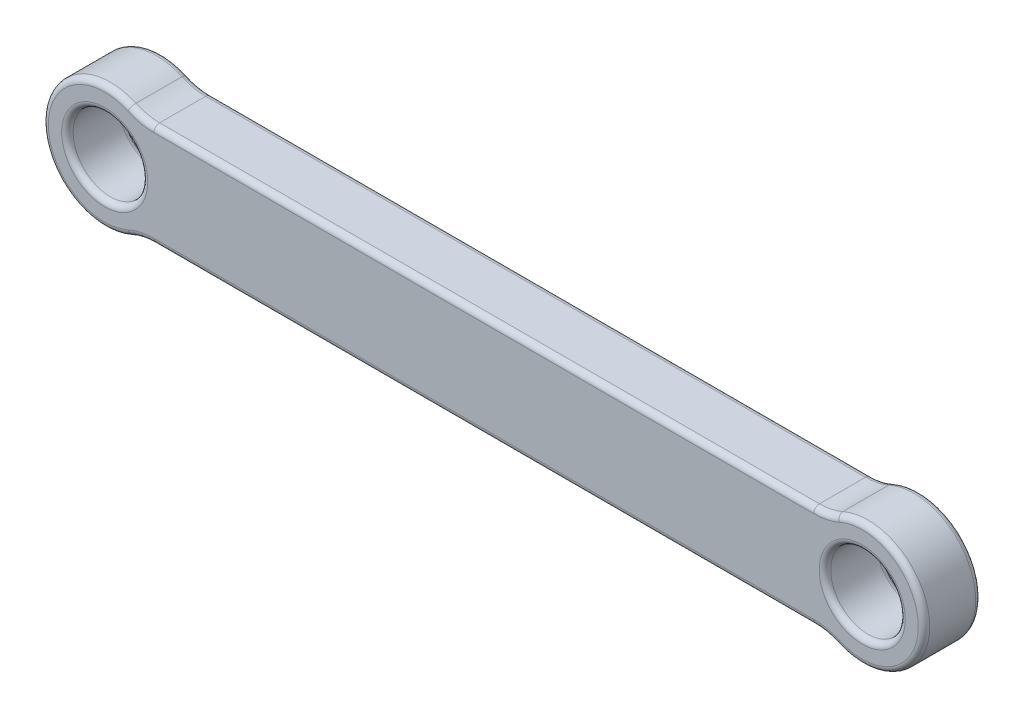
ISO-10303-21;
HEADER;
FILE_DESCRIPTION(('STEP AP214'),'2;1');
FILE_NAME('part.step','',(''),(''),'','','');
FILE_SCHEMA(('AUTOMOTIVE_DESIGN { 1 0 10303 214 1 1 1 1 }'));
ENDSEC;
DATA;
#1=APPLICATION_CONTEXT('core data for automotive mechanical design processes');
#2=APPLICATION_PROTOCOL_DEFINITION('international standard','automotive_design',2000,#1);
#3=PRODUCT_CONTEXT('',#1,'mechanical');
#4=PRODUCT('Part','Part','',(#3));
#5=PRODUCT_RELATED_PRODUCT_CATEGORY('part','',(#4));
#6=PRODUCT_DEFINITION_FORMATION('','',#4);
#7=PRODUCT_DEFINITION_CONTEXT('part definition',#1,'design');
#8=PRODUCT_DEFINITION('design','',#6,#7);
#9=PRODUCT_DEFINITION_SHAPE('','',#8);
#10=(LENGTH_UNIT() NAMED_UNIT(*) SI_UNIT(.MILLI.,.METRE.));
#11=(NAMED_UNIT(*) PLANE_ANGLE_UNIT() SI_UNIT($,.RADIAN.));
#12=(NAMED_UNIT(*) SI_UNIT($,.STERADIAN.) SOLID_ANGLE_UNIT());
#13=UNCERTAINTY_MEASURE_WITH_UNIT(LENGTH_MEASURE(1.E-05),#10,'distance_accuracy_value','');
#14=(GEOMETRIC_REPRESENTATION_CONTEXT(3) GLOBAL_UNCERTAINTY_ASSIGNED_CONTEXT((#13)) GLOBAL_UNIT_ASSIGNED_CONTEXT((#10,
#11,#12)) REPRESENTATION_CONTEXT('',''));
#15=CARTESIAN_POINT('',(0.,0.,0.));
#16=DIRECTION('',(0.,0.,1.));
#17=DIRECTION('',(1.,0.,0.));
#18=AXIS2_PLACEMENT_3D('',#15,#16,#17);
#19=CARTESIAN_POINT('',(66.,0.,10.));
#20=DIRECTION('',(0.,0.,-1.));
#21=DIRECTION('',(-1.,0.,0.));
#22=AXIS2_PLACEMENT_3D('',#19,#20,#21);
#23=CYLINDRICAL_SURFACE('',#22,10.7570458942095);
#24=DIRECTION('',(0.,0.,-1.));
#25=VECTOR('',#24,1.);
#26=CARTESIAN_POINT('',(61.6265111237039,-9.82784978614567,10.));
#27=LINE('',#26,#25);
#28=CARTESIAN_POINT('',(61.6265111237039,-9.82784978614567,9.));
#29=VERTEX_POINT('',#28);
#30=CARTESIAN_POINT('',(61.6265111237039,-9.82784978614567,0.999999999999999));
#31=VERTEX_POINT('',#30);
#32=EDGE_CURVE('E308',#29,#31,#27,.T.);
#33=ORIENTED_EDGE('',*,*,#32,.T.);
#34=CARTESIAN_POINT('',(66.,0.,0.999999999999999));
#35=DIRECTION('',(0.,0.,1.));
#36=DIRECTION('',(1.,0.,0.));
#37=AXIS2_PLACEMENT_3D('',#34,#35,#36);
#38=CIRCLE('',#37,10.7570458942095);
#39=CARTESIAN_POINT('',(61.6265111237039,9.82784978614571,0.999999999999999));
#40=VERTEX_POINT('',#39);
#41=EDGE_CURVE('E216',#31,#40,#38,.T.);
#42=ORIENTED_EDGE('',*,*,#41,.T.);
#43=DIRECTION('',(0.,0.,-1.));
#44=VECTOR('',#43,1.);
#45=CARTESIAN_POINT('',(61.6265111237039,9.82784978614571,10.));
#46=LINE('',#45,#44);
#47=CARTESIAN_POINT('',(61.6265111237039,9.82784978614571,9.));
#48=VERTEX_POINT('',#47);
#49=EDGE_CURVE('E265',#40,#48,#46,.F.);
#50=ORIENTED_EDGE('',*,*,#49,.T.);
#51=CARTESIAN_POINT('',(66.,0.,9.));
#52=DIRECTION('',(0.,0.,1.));
#53=DIRECTION('',(1.,0.,0.));
#54=AXIS2_PLACEMENT_3D('',#51,#52,#53);
#55=CIRCLE('',#54,10.7570458942095);
#56=EDGE_CURVE('E214',#48,#29,#55,.F.);
#57=ORIENTED_EDGE('',*,*,#56,.T.);
#58=EDGE_LOOP('',(#33,#42,#50,#57));
#59=FACE_BOUND('',#58,.T.);
#60=ADVANCED_FACE('F41',(#59),#23,.T.);
#61=CARTESIAN_POINT('',(60.0535818179112,8.96404747721998,10.));
#62=DIRECTION('',(0.,-1.,0.));
#63=DIRECTION('',(1.,0.,0.));
#64=AXIS2_PLACEMENT_3D('',#61,#62,#63);
#65=PLANE('',#64);
#66=DIRECTION('',(0.,0.,1.));
#67=VECTOR('',#66,1.);
#68=CARTESIAN_POINT('',(57.5608141662795,8.96404747721998,0.));
#69=LINE('',#68,#67);
#70=CARTESIAN_POINT('',(57.5608141662795,8.96404747721998,9.));
#71=VERTEX_POINT('',#70);
#72=CARTESIAN_POINT('',(57.5608141662795,8.96404747721998,0.999999999999999));
#73=VERTEX_POINT('',#72);
#74=EDGE_CURVE('E304',#71,#73,#69,.F.);
#75=ORIENTED_EDGE('',*,*,#74,.T.);
#76=DIRECTION('',(-1.,0.,0.));
#77=VECTOR('',#76,1.);
#78=CARTESIAN_POINT('',(60.0535818179112,8.96404747721998,0.999999999999999));
#79=LINE('',#78,#77);
#80=CARTESIAN_POINT('',(-57.4152472481973,8.96404747721997,0.999999999999999));
#81=VERTEX_POINT('',#80);
#82=EDGE_CURVE('E191',#73,#81,#79,.T.);
#83=ORIENTED_EDGE('',*,*,#82,.T.);
#84=DIRECTION('',(0.,0.,1.));
#85=VECTOR('',#84,1.);
#86=CARTESIAN_POINT('',(-57.4152472481973,8.96404747721997,10.));
#87=LINE('',#86,#85);
#88=CARTESIAN_POINT('',(-57.4152472481973,8.96404747721997,9.));
#89=VERTEX_POINT('',#88);
#90=EDGE_CURVE('E324',#81,#89,#87,.T.);
#91=ORIENTED_EDGE('',*,*,#90,.T.);
#92=DIRECTION('',(-1.,0.,0.));
#93=VECTOR('',#92,1.);
#94=CARTESIAN_POINT('',(57.5608141662795,8.96404747721998,9.));
#95=LINE('',#94,#93);
#96=EDGE_CURVE('E189',#89,#71,#95,.F.);
#97=ORIENTED_EDGE('',*,*,#96,.T.);
#98=EDGE_LOOP('',(#75,#83,#91,#97));
#99=FACE_BOUND('',#98,.T.);
#100=ADVANCED_FACE('F351',(#99),#65,.F.);
#101=CARTESIAN_POINT('',(-66.,0.,10.));
#102=DIRECTION('',(0.,0.,-1.));
#103=DIRECTION('',(-1.,0.,0.));
#104=AXIS2_PLACEMENT_3D('',#101,#102,#103);
#105=CYLINDRICAL_SURFACE('',#104,10.8166538263919);
#106=DIRECTION('',(0.,0.,-1.));
#107=VECTOR('',#106,1.);
#108=CARTESIAN_POINT('',(-61.5392302972495,9.85401104419016,10.));
#109=LINE('',#108,#107);
#110=CARTESIAN_POINT('',(-61.5392302972495,9.85401104419016,9.));
#111=VERTEX_POINT('',#110);
#112=CARTESIAN_POINT('',(-61.5392302972495,9.85401104419016,0.999999999999999));
#113=VERTEX_POINT('',#112);
#114=EDGE_CURVE('E318',#111,#113,#109,.T.);
#115=ORIENTED_EDGE('',*,*,#114,.T.);
#116=CARTESIAN_POINT('',(-66.,0.,0.999999999999999));
#117=DIRECTION('',(0.,0.,1.));
#118=DIRECTION('',(1.,0.,0.));
#119=AXIS2_PLACEMENT_3D('',#116,#117,#118);
#120=CIRCLE('',#119,10.8166538263919);
#121=CARTESIAN_POINT('',(-61.5392302972495,-9.85401104419017,0.999999999999999));
#122=VERTEX_POINT('',#121);
#123=EDGE_CURVE('E199',#113,#122,#120,.T.);
#124=ORIENTED_EDGE('',*,*,#123,.T.);
#125=DIRECTION('',(0.,0.,-1.));
#126=VECTOR('',#125,1.);
#127=CARTESIAN_POINT('',(-61.5392302972495,-9.85401104419017,10.));
#128=LINE('',#127,#126);
#129=CARTESIAN_POINT('',(-61.5392302972495,-9.85401104419017,9.));
#130=VERTEX_POINT('',#129);
#131=EDGE_CURVE('E321',#122,#130,#128,.F.);
#132=ORIENTED_EDGE('',*,*,#131,.T.);
#133=CARTESIAN_POINT('',(-66.,0.,9.));
#134=DIRECTION('',(0.,0.,1.));
#135=DIRECTION('',(1.,0.,0.));
#136=AXIS2_PLACEMENT_3D('',#133,#134,#135);
#137=CIRCLE('',#136,10.8166538263919);
#138=EDGE_CURVE('E197',#130,#111,#137,.F.);
#139=ORIENTED_EDGE('',*,*,#138,.T.);
#140=EDGE_LOOP('',(#115,#124,#132,#139));
#141=FACE_BOUND('',#140,.T.);
#142=ADVANCED_FACE('F396',(#141),#105,.T.);
#143=CARTESIAN_POINT('',(60.0535818179112,-8.96404747721995,10.));
#144=DIRECTION('',(0.,1.,0.));
#145=DIRECTION('',(-1.,0.,0.));
#146=AXIS2_PLACEMENT_3D('',#143,#144,#145);
#147=PLANE('',#146);
#148=DIRECTION('',(0.,0.,1.));
#149=VECTOR('',#148,1.);
#150=CARTESIAN_POINT('',(-57.4152472481973,-8.96404747721996,0.));
#151=LINE('',#150,#149);
#152=CARTESIAN_POINT('',(-57.4152472481973,-8.96404747721996,9.));
#153=VERTEX_POINT('',#152);
#154=CARTESIAN_POINT('',(-57.4152472481973,-8.96404747721996,0.999999999999999));
#155=VERTEX_POINT('',#154);
#156=EDGE_CURVE('E310',#153,#155,#151,.F.);
#157=ORIENTED_EDGE('',*,*,#156,.T.);
#158=DIRECTION('',(1.,0.,0.));
#159=VECTOR('',#158,1.);
#160=CARTESIAN_POINT('',(60.0535818179112,-8.96404747721995,0.999999999999999));
#161=LINE('',#160,#159);
#162=CARTESIAN_POINT('',(57.5608141662796,-8.96404747721995,0.999999999999999));
#163=VERTEX_POINT('',#162);
#164=EDGE_CURVE('E208',#155,#163,#161,.T.);
#165=ORIENTED_EDGE('',*,*,#164,.T.);
#166=DIRECTION('',(0.,0.,1.));
#167=VECTOR('',#166,1.);
#168=CARTESIAN_POINT('',(57.5608141662796,-8.96404747721995,10.));
#169=LINE('',#168,#167);
#170=CARTESIAN_POINT('',(57.5608141662796,-8.96404747721995,9.));
#171=VERTEX_POINT('',#170);
#172=EDGE_CURVE('E315',#163,#171,#169,.T.);
#173=ORIENTED_EDGE('',*,*,#172,.T.);
#174=DIRECTION('',(1.,0.,0.));
#175=VECTOR('',#174,1.);
#176=CARTESIAN_POINT('',(-57.4152472481973,-8.96404747721996,9.));
#177=LINE('',#176,#175);
#178=EDGE_CURVE('E206',#171,#153,#177,.F.);
#179=ORIENTED_EDGE('',*,*,#178,.T.);
#180=EDGE_LOOP('',(#157,#165,#173,#179));
#181=FACE_BOUND('',#180,.T.);
#182=ADVANCED_FACE('F380',(#181),#147,.F.);
#183=CARTESIAN_POINT('',(66.,0.,10.));
#184=DIRECTION('',(0.,0.,1.));
#185=DIRECTION('',(1.,0.,0.));
#186=AXIS2_PLACEMENT_3D('',#183,#184,#185);
#187=PLANE('',#186);
#188=CARTESIAN_POINT('',(-66.,0.,10.));
#189=DIRECTION('',(0.,0.,1.));
#190=DIRECTION('',(1.,0.,0.));
#191=AXIS2_PLACEMENT_3D('',#188,#189,#190);
#192=CIRCLE('',#191,9.81665382639193);
#193=CARTESIAN_POINT('',(-61.9516286021547,8.94300740088718,10.));
#194=VERTEX_POINT('',#193);
#195=CARTESIAN_POINT('',(-61.9516286021547,-8.94300740088719,10.));
#196=VERTEX_POINT('',#195);
#197=EDGE_CURVE('E50',#194,#196,#192,.T.);
#198=ORIENTED_EDGE('',*,*,#197,.T.);
#199=CARTESIAN_POINT('',(-57.4152472481973,-18.96404747722,10.));
#200=DIRECTION('',(0.,0.,1.));
#201=DIRECTION('',(1.,0.,0.));
#202=AXIS2_PLACEMENT_3D('',#199,#200,#201);
#203=CIRCLE('',#202,11.);
#204=CARTESIAN_POINT('',(-57.4152472481973,-7.96404747721996,10.));
#205=VERTEX_POINT('',#204);
#206=EDGE_CURVE('E11',#196,#205,#203,.F.);
#207=ORIENTED_EDGE('',*,*,#206,.T.);
#208=DIRECTION('',(1.,0.,0.));
#209=VECTOR('',#208,1.);
#210=CARTESIAN_POINT('',(57.5608141662796,-7.96404747721995,10.));
#211=LINE('',#210,#209);
#212=CARTESIAN_POINT('',(57.5608141662796,-7.96404747721995,10.));
#213=VERTEX_POINT('',#212);
#214=EDGE_CURVE('E236',#205,#213,#211,.T.);
#215=ORIENTED_EDGE('',*,*,#214,.T.);
#216=CARTESIAN_POINT('',(57.5608141662796,-18.9640474772199,10.));
#217=DIRECTION('',(0.,0.,1.));
#218=DIRECTION('',(1.,0.,0.));
#219=AXIS2_PLACEMENT_3D('',#216,#217,#218);
#220=CIRCLE('',#219,11.);
#221=CARTESIAN_POINT('',(62.0330808194463,-8.91423001703824,10.));
#222=VERTEX_POINT('',#221);
#223=EDGE_CURVE('E238',#213,#222,#220,.F.);
#224=ORIENTED_EDGE('',*,*,#223,.T.);
#225=CARTESIAN_POINT('',(66.,0.,10.));
#226=DIRECTION('',(0.,0.,1.));
#227=DIRECTION('',(1.,0.,0.));
#228=AXIS2_PLACEMENT_3D('',#225,#226,#227);
#229=CIRCLE('',#228,9.75704589420951);
#230=CARTESIAN_POINT('',(62.0330808194463,8.91423001703829,10.));
#231=VERTEX_POINT('',#230);
#232=EDGE_CURVE('E240',#222,#231,#229,.T.);
#233=ORIENTED_EDGE('',*,*,#232,.T.);
#234=CARTESIAN_POINT('',(57.5608141662795,18.96404747722,10.));
#235=DIRECTION('',(0.,0.,1.));
#236=DIRECTION('',(1.,0.,0.));
#237=AXIS2_PLACEMENT_3D('',#234,#235,#236);
#238=CIRCLE('',#237,11.);
#239=CARTESIAN_POINT('',(57.5608141662795,7.96404747721998,10.));
#240=VERTEX_POINT('',#239);
#241=EDGE_CURVE('E242',#231,#240,#238,.F.);
#242=ORIENTED_EDGE('',*,*,#241,.T.);
#243=DIRECTION('',(-1.,0.,0.));
#244=VECTOR('',#243,1.);
#245=CARTESIAN_POINT('',(-57.4152472481973,7.96404747721997,10.));
#246=LINE('',#245,#244);
#247=CARTESIAN_POINT('',(-57.4152472481973,7.96404747721997,10.));
#248=VERTEX_POINT('',#247);
#249=EDGE_CURVE('E244',#240,#248,#246,.T.);
#250=ORIENTED_EDGE('',*,*,#249,.T.);
#251=CARTESIAN_POINT('',(-57.4152472481973,18.96404747722,10.));
#252=DIRECTION('',(0.,0.,1.));
#253=DIRECTION('',(1.,0.,0.));
#254=AXIS2_PLACEMENT_3D('',#251,#252,#253);
#255=CIRCLE('',#254,11.);
#256=EDGE_CURVE('E61',#248,#194,#255,.F.);
#257=ORIENTED_EDGE('',*,*,#256,.T.);
#258=EDGE_LOOP('',(#198,#207,#215,#224,#233,#242,#250,#257));
#259=FACE_BOUND('',#258,.T.);
#260=CARTESIAN_POINT('',(-66.,0.,10.));
#261=DIRECTION('',(0.,0.,1.));
#262=DIRECTION('',(1.,0.,0.));
#263=AXIS2_PLACEMENT_3D('',#260,#261,#262);
#264=CIRCLE('',#263,7.5);
#265=CARTESIAN_POINT('',(-58.5,0.,10.));
#266=VERTEX_POINT('',#265);
#267=EDGE_CURVE('E233',#266,#266,#264,.F.);
#268=ORIENTED_EDGE('',*,*,#267,.T.);
#269=EDGE_LOOP('',(#268));
#270=FACE_BOUND('',#269,.T.);
#271=CARTESIAN_POINT('',(66.,0.,10.));
#272=DIRECTION('',(0.,0.,1.));
#273=DIRECTION('',(1.,0.,0.));
#274=AXIS2_PLACEMENT_3D('',#271,#272,#273);
#275=CIRCLE('',#274,7.5);
#276=CARTESIAN_POINT('',(73.5,0.,10.));
#277=VERTEX_POINT('',#276);
#278=EDGE_CURVE('E230',#277,#277,#275,.F.);
#279=ORIENTED_EDGE('',*,*,#278,.T.);
#280=EDGE_LOOP('',(#279));
#281=FACE_BOUND('',#280,.T.);
#282=ADVANCED_FACE('F367',(#259,#270,#281),#187,.T.);
#283=CARTESIAN_POINT('',(66.,0.,0.));
#284=DIRECTION('',(0.,0.,1.));
#285=DIRECTION('',(1.,0.,0.));
#286=AXIS2_PLACEMENT_3D('',#283,#284,#285);
#287=PLANE('',#286);
#288=DIRECTION('',(-1.,0.,0.));
#289=VECTOR('',#288,1.);
#290=CARTESIAN_POINT('',(66.,7.96404747721998,0.));
#291=LINE('',#290,#289);
#292=CARTESIAN_POINT('',(-57.4152472481973,7.96404747721997,0.));
#293=VERTEX_POINT('',#292);
#294=CARTESIAN_POINT('',(57.5608141662795,7.96404747721998,0.));
#295=VERTEX_POINT('',#294);
#296=EDGE_CURVE('E179',#293,#295,#291,.F.);
#297=ORIENTED_EDGE('',*,*,#296,.T.);
#298=CARTESIAN_POINT('',(57.5608141662795,18.96404747722,0.));
#299=DIRECTION('',(0.,0.,1.));
#300=DIRECTION('',(1.,0.,0.));
#301=AXIS2_PLACEMENT_3D('',#298,#299,#300);
#302=CIRCLE('',#301,11.);
#303=CARTESIAN_POINT('',(62.0330808194463,8.91423001703829,0.));
#304=VERTEX_POINT('',#303);
#305=EDGE_CURVE('E159',#295,#304,#302,.T.);
#306=ORIENTED_EDGE('',*,*,#305,.T.);
#307=CARTESIAN_POINT('',(66.,0.,0.));
#308=DIRECTION('',(0.,0.,1.));
#309=DIRECTION('',(1.,0.,0.));
#310=AXIS2_PLACEMENT_3D('',#307,#308,#309);
#311=CIRCLE('',#310,9.75704589420951);
#312=CARTESIAN_POINT('',(62.0330808194463,-8.91423001703824,0.));
#313=VERTEX_POINT('',#312);
#314=EDGE_CURVE('E167',#304,#313,#311,.F.);
#315=ORIENTED_EDGE('',*,*,#314,.T.);
#316=CARTESIAN_POINT('',(57.5608141662796,-18.9640474772199,0.));
#317=DIRECTION('',(0.,0.,1.));
#318=DIRECTION('',(1.,0.,0.));
#319=AXIS2_PLACEMENT_3D('',#316,#317,#318);
#320=CIRCLE('',#319,11.);
#321=CARTESIAN_POINT('',(57.5608141662796,-7.96404747721995,0.));
#322=VERTEX_POINT('',#321);
#323=EDGE_CURVE('E173',#313,#322,#320,.T.);
#324=ORIENTED_EDGE('',*,*,#323,.T.);
#325=DIRECTION('',(1.,0.,0.));
#326=VECTOR('',#325,1.);
#327=CARTESIAN_POINT('',(66.,-7.96404747721995,0.));
#328=LINE('',#327,#326);
#329=CARTESIAN_POINT('',(-57.4152472481973,-7.96404747721996,0.));
#330=VERTEX_POINT('',#329);
#331=EDGE_CURVE('E334',#322,#330,#328,.F.);
#332=ORIENTED_EDGE('',*,*,#331,.T.);
#333=CARTESIAN_POINT('',(-57.4152472481973,-18.96404747722,0.));
#334=DIRECTION('',(0.,0.,1.));
#335=DIRECTION('',(1.,0.,0.));
#336=AXIS2_PLACEMENT_3D('',#333,#334,#335);
#337=CIRCLE('',#336,11.);
#338=CARTESIAN_POINT('',(-61.9516286021547,-8.94300740088719,0.));
#339=VERTEX_POINT('',#338);
#340=EDGE_CURVE('E336',#330,#339,#337,.T.);
#341=ORIENTED_EDGE('',*,*,#340,.T.);
#342=CARTESIAN_POINT('',(-66.,0.,0.));
#343=DIRECTION('',(0.,0.,1.));
#344=DIRECTION('',(1.,0.,0.));
#345=AXIS2_PLACEMENT_3D('',#342,#343,#344);
#346=CIRCLE('',#345,9.81665382639193);
#347=CARTESIAN_POINT('',(-61.9516286021547,8.94300740088718,0.));
#348=VERTEX_POINT('',#347);
#349=EDGE_CURVE('E338',#339,#348,#346,.F.);
#350=ORIENTED_EDGE('',*,*,#349,.T.);
#351=CARTESIAN_POINT('',(-57.4152472481973,18.96404747722,0.));
#352=DIRECTION('',(0.,0.,1.));
#353=DIRECTION('',(1.,0.,0.));
#354=AXIS2_PLACEMENT_3D('',#351,#352,#353);
#355=CIRCLE('',#354,11.);
#356=EDGE_CURVE('E184',#348,#293,#355,.T.);
#357=ORIENTED_EDGE('',*,*,#356,.T.);
#358=EDGE_LOOP('',(#297,#306,#315,#324,#332,#341,#350,#357));
#359=FACE_BOUND('',#358,.T.);
#360=CARTESIAN_POINT('',(-66.,0.,0.));
#361=DIRECTION('',(0.,0.,1.));
#362=DIRECTION('',(1.,0.,0.));
#363=AXIS2_PLACEMENT_3D('',#360,#361,#362);
#364=CIRCLE('',#363,7.5);
#365=CARTESIAN_POINT('',(-58.5,0.,0.));
#366=VERTEX_POINT('',#365);
#367=EDGE_CURVE('E174',#366,#366,#364,.T.);
#368=ORIENTED_EDGE('',*,*,#367,.T.);
#369=EDGE_LOOP('',(#368));
#370=FACE_BOUND('',#369,.T.);
#371=CARTESIAN_POINT('',(66.,0.,0.));
#372=DIRECTION('',(0.,0.,1.));
#373=DIRECTION('',(1.,0.,0.));
#374=AXIS2_PLACEMENT_3D('',#371,#372,#373);
#375=CIRCLE('',#374,7.5);
#376=CARTESIAN_POINT('',(73.5,0.,0.));
#377=VERTEX_POINT('',#376);
#378=EDGE_CURVE('E328',#377,#377,#375,.T.);
#379=ORIENTED_EDGE('',*,*,#378,.T.);
#380=EDGE_LOOP('',(#379));
#381=FACE_BOUND('',#380,.T.);
#382=ADVANCED_FACE('F176',(#359,#370,#381),#287,.F.);
#383=CARTESIAN_POINT('',(-66.,0.,0.));
#384=DIRECTION('',(0.,0.,1.));
#385=DIRECTION('',(1.,0.,0.));
#386=AXIS2_PLACEMENT_3D('',#383,#384,#385);
#387=CYLINDRICAL_SURFACE('',#386,6.5);
#388=CARTESIAN_POINT('',(-66.,0.,1.));
#389=DIRECTION('',(0.,0.,1.));
#390=DIRECTION('',(1.,0.,0.));
#391=AXIS2_PLACEMENT_3D('',#388,#389,#390);
#392=CIRCLE('',#391,6.5);
#393=CARTESIAN_POINT('',(-59.5,0.,1.));
#394=VERTEX_POINT('',#393);
#395=EDGE_CURVE('E221',#394,#394,#392,.F.);
#396=ORIENTED_EDGE('',*,*,#395,.T.);
#397=EDGE_LOOP('',(#396));
#398=FACE_BOUND('',#397,.T.);
#399=CARTESIAN_POINT('',(-66.,0.,9.));
#400=DIRECTION('',(0.,0.,1.));
#401=DIRECTION('',(1.,0.,0.));
#402=AXIS2_PLACEMENT_3D('',#399,#400,#401);
#403=CIRCLE('',#402,6.5);
#404=CARTESIAN_POINT('',(-59.5,0.,9.));
#405=VERTEX_POINT('',#404);
#406=EDGE_CURVE('E218',#405,#405,#403,.T.);
#407=ORIENTED_EDGE('',*,*,#406,.T.);
#408=EDGE_LOOP('',(#407));
#409=FACE_BOUND('',#408,.T.);
#410=ADVANCED_FACE('F476',(#398,#409),#387,.F.);
#411=CARTESIAN_POINT('',(66.,0.,0.));
#412=DIRECTION('',(0.,0.,1.));
#413=DIRECTION('',(1.,0.,0.));
#414=AXIS2_PLACEMENT_3D('',#411,#412,#413);
#415=CYLINDRICAL_SURFACE('',#414,6.5);
#416=CARTESIAN_POINT('',(66.,0.,1.));
#417=DIRECTION('',(0.,0.,1.));
#418=DIRECTION('',(1.,0.,0.));
#419=AXIS2_PLACEMENT_3D('',#416,#417,#418);
#420=CIRCLE('',#419,6.5);
#421=CARTESIAN_POINT('',(72.5,0.,1.));
#422=VERTEX_POINT('',#421);
#423=EDGE_CURVE('E227',#422,#422,#420,.F.);
#424=ORIENTED_EDGE('',*,*,#423,.T.);
#425=EDGE_LOOP('',(#424));
#426=FACE_BOUND('',#425,.T.);
#427=CARTESIAN_POINT('',(66.,0.,9.));
#428=DIRECTION('',(0.,0.,1.));
#429=DIRECTION('',(1.,0.,0.));
#430=AXIS2_PLACEMENT_3D('',#427,#428,#429);
#431=CIRCLE('',#430,6.5);
#432=CARTESIAN_POINT('',(72.5,0.,9.));
#433=VERTEX_POINT('',#432);
#434=EDGE_CURVE('E224',#433,#433,#431,.T.);
#435=ORIENTED_EDGE('',*,*,#434,.T.);
#436=EDGE_LOOP('',(#435));
#437=FACE_BOUND('',#436,.T.);
#438=ADVANCED_FACE('F413',(#426,#437),#415,.F.);
#439=CARTESIAN_POINT('',(57.5608141662796,-18.9640474772199,10.));
#440=DIRECTION('',(0.,0.,-1.));
#441=DIRECTION('',(-1.,0.,0.));
#442=AXIS2_PLACEMENT_3D('',#439,#440,#441);
#443=CYLINDRICAL_SURFACE('',#442,10.);
#444=ORIENTED_EDGE('',*,*,#172,.F.);
#445=CARTESIAN_POINT('',(57.5608141662796,-18.9640474772199,0.999999999999999));
#446=DIRECTION('',(0.,0.,1.));
#447=DIRECTION('',(1.,0.,0.));
#448=AXIS2_PLACEMENT_3D('',#445,#446,#447);
#449=CIRCLE('',#448,10.);
#450=EDGE_CURVE('E212',#163,#31,#449,.F.);
#451=ORIENTED_EDGE('',*,*,#450,.T.);
#452=ORIENTED_EDGE('',*,*,#32,.F.);
#453=CARTESIAN_POINT('',(57.5608141662796,-18.9640474772199,9.));
#454=DIRECTION('',(0.,0.,1.));
#455=DIRECTION('',(1.,0.,0.));
#456=AXIS2_PLACEMENT_3D('',#453,#454,#455);
#457=CIRCLE('',#456,10.);
#458=EDGE_CURVE('E210',#29,#171,#457,.T.);
#459=ORIENTED_EDGE('',*,*,#458,.T.);
#460=EDGE_LOOP('',(#444,#451,#452,#459));
#461=FACE_BOUND('',#460,.T.);
#462=ADVANCED_FACE('F410',(#461),#443,.F.);
#463=CARTESIAN_POINT('',(-57.4152472481973,-18.96404747722,10.));
#464=DIRECTION('',(0.,0.,-1.));
#465=DIRECTION('',(-1.,0.,0.));
#466=AXIS2_PLACEMENT_3D('',#463,#464,#465);
#467=CYLINDRICAL_SURFACE('',#466,10.);
#468=ORIENTED_EDGE('',*,*,#131,.F.);
#469=CARTESIAN_POINT('',(-57.4152472481973,-18.96404747722,0.999999999999999));
#470=DIRECTION('',(0.,0.,1.));
#471=DIRECTION('',(1.,0.,0.));
#472=AXIS2_PLACEMENT_3D('',#469,#470,#471);
#473=CIRCLE('',#472,10.);
#474=EDGE_CURVE('E204',#122,#155,#473,.F.);
#475=ORIENTED_EDGE('',*,*,#474,.T.);
#476=ORIENTED_EDGE('',*,*,#156,.F.);
#477=CARTESIAN_POINT('',(-57.4152472481973,-18.96404747722,9.));
#478=DIRECTION('',(0.,0.,1.));
#479=DIRECTION('',(1.,0.,0.));
#480=AXIS2_PLACEMENT_3D('',#477,#478,#479);
#481=CIRCLE('',#480,10.);
#482=EDGE_CURVE('E201',#153,#130,#481,.T.);
#483=ORIENTED_EDGE('',*,*,#482,.T.);
#484=EDGE_LOOP('',(#468,#475,#476,#483));
#485=FACE_BOUND('',#484,.T.);
#486=ADVANCED_FACE('F385',(#485),#467,.F.);
#487=CARTESIAN_POINT('',(57.5608141662795,18.96404747722,10.));
#488=DIRECTION('',(0.,0.,-1.));
#489=DIRECTION('',(-1.,0.,0.));
#490=AXIS2_PLACEMENT_3D('',#487,#488,#489);
#491=CYLINDRICAL_SURFACE('',#490,10.);
#492=ORIENTED_EDGE('',*,*,#49,.F.);
#493=CARTESIAN_POINT('',(57.5608141662795,18.96404747722,0.999999999999999));
#494=DIRECTION('',(0.,0.,1.));
#495=DIRECTION('',(1.,0.,0.));
#496=AXIS2_PLACEMENT_3D('',#493,#494,#495);
#497=CIRCLE('',#496,10.);
#498=EDGE_CURVE('E161',#40,#73,#497,.F.);
#499=ORIENTED_EDGE('',*,*,#498,.T.);
#500=ORIENTED_EDGE('',*,*,#74,.F.);
#501=CARTESIAN_POINT('',(57.5608141662795,18.96404747722,9.));
#502=DIRECTION('',(0.,0.,1.));
#503=DIRECTION('',(1.,0.,0.));
#504=AXIS2_PLACEMENT_3D('',#501,#502,#503);
#505=CIRCLE('',#504,10.);
#506=EDGE_CURVE('E181',#71,#48,#505,.T.);
#507=ORIENTED_EDGE('',*,*,#506,.T.);
#508=EDGE_LOOP('',(#492,#499,#500,#507));
#509=FACE_BOUND('',#508,.T.);
#510=ADVANCED_FACE('F302',(#509),#491,.F.);
#511=CARTESIAN_POINT('',(-57.4152472481973,18.96404747722,10.));
#512=DIRECTION('',(0.,0.,-1.));
#513=DIRECTION('',(-1.,0.,0.));
#514=AXIS2_PLACEMENT_3D('',#511,#512,#513);
#515=CYLINDRICAL_SURFACE('',#514,10.);
#516=ORIENTED_EDGE('',*,*,#90,.F.);
#517=CARTESIAN_POINT('',(-57.4152472481973,18.96404747722,0.999999999999999));
#518=DIRECTION('',(0.,0.,1.));
#519=DIRECTION('',(1.,0.,0.));
#520=AXIS2_PLACEMENT_3D('',#517,#518,#519);
#521=CIRCLE('',#520,10.);
#522=EDGE_CURVE('E195',#81,#113,#521,.F.);
#523=ORIENTED_EDGE('',*,*,#522,.T.);
#524=ORIENTED_EDGE('',*,*,#114,.F.);
#525=CARTESIAN_POINT('',(-57.4152472481973,18.96404747722,9.));
#526=DIRECTION('',(0.,0.,1.));
#527=DIRECTION('',(1.,0.,0.));
#528=AXIS2_PLACEMENT_3D('',#525,#526,#527);
#529=CIRCLE('',#528,10.);
#530=EDGE_CURVE('E193',#111,#89,#529,.T.);
#531=ORIENTED_EDGE('',*,*,#530,.T.);
#532=EDGE_LOOP('',(#516,#523,#524,#531));
#533=FACE_BOUND('',#532,.T.);
#534=ADVANCED_FACE('F353',(#533),#515,.F.);
#535=CARTESIAN_POINT('',(-57.4152472481973,-18.96404747722,0.999999999999999));
#536=DIRECTION('',(0.,0.,1.));
#537=DIRECTION('',(1.,0.,0.));
#538=AXIS2_PLACEMENT_3D('',#535,#536,#537);
#539=TOROIDAL_SURFACE('',#538,11.,1.);
#540=CARTESIAN_POINT('',(-57.4152472481973,-7.96404747721996,0.999999999999999));
#541=DIRECTION('',(1.,0.,0.));
#542=DIRECTION('',(0.,0.,-1.));
#543=AXIS2_PLACEMENT_3D('',#540,#541,#542);
#544=CIRCLE('',#543,1.);
#545=EDGE_CURVE('E259',#155,#330,#544,.T.);
#546=ORIENTED_EDGE('',*,*,#545,.F.);
#547=ORIENTED_EDGE('',*,*,#474,.F.);
#548=CARTESIAN_POINT('',(-61.9516286021547,-8.94300740088719,1.));
#549=DIRECTION('',(-0.911003643302979,-0.412398304905221,0.));
#550=DIRECTION('',(0.412398304905221,-0.911003643302979,0.));
#551=AXIS2_PLACEMENT_3D('',#548,#549,#550);
#552=CIRCLE('',#551,1.);
#553=EDGE_CURVE('E262',#339,#122,#552,.T.);
#554=ORIENTED_EDGE('',*,*,#553,.F.);
#555=ORIENTED_EDGE('',*,*,#340,.F.);
#556=EDGE_LOOP('',(#546,#547,#554,#555));
#557=FACE_BOUND('',#556,.T.);
#558=ADVANCED_FACE('F389',(#557),#539,.T.);
#559=CARTESIAN_POINT('',(-66.,0.,0.999999999999999));
#560=DIRECTION('',(0.,0.,1.));
#561=DIRECTION('',(1.,0.,0.));
#562=AXIS2_PLACEMENT_3D('',#559,#560,#561);
#563=TOROIDAL_SURFACE('',#562,9.81665382639193,1.);
#564=ORIENTED_EDGE('',*,*,#553,.T.);
#565=ORIENTED_EDGE('',*,*,#123,.F.);
#566=CARTESIAN_POINT('',(-61.9516286021547,8.94300740088718,1.));
#567=DIRECTION('',(0.911003643302982,-0.412398304905214,0.));
#568=DIRECTION('',(0.412398304905214,0.911003643302982,0.));
#569=AXIS2_PLACEMENT_3D('',#566,#567,#568);
#570=CIRCLE('',#569,1.);
#571=EDGE_CURVE('E256',#348,#113,#570,.T.);
#572=ORIENTED_EDGE('',*,*,#571,.F.);
#573=ORIENTED_EDGE('',*,*,#349,.F.);
#574=EDGE_LOOP('',(#564,#565,#572,#573));
#575=FACE_BOUND('',#574,.T.);
#576=ADVANCED_FACE('F394',(#575),#563,.T.);
#577=CARTESIAN_POINT('',(60.0535818179112,-7.96404747721995,0.999999999999999));
#578=DIRECTION('',(1.,0.,0.));
#579=DIRECTION('',(0.,1.,0.));
#580=AXIS2_PLACEMENT_3D('',#577,#578,#579);
#581=CYLINDRICAL_SURFACE('',#580,1.);
#582=ORIENTED_EDGE('',*,*,#545,.T.);
#583=ORIENTED_EDGE('',*,*,#331,.F.);
#584=CARTESIAN_POINT('',(57.5608141662796,-7.96404747721995,0.999999999999999));
#585=DIRECTION('',(1.,0.,0.));
#586=DIRECTION('',(0.,0.,-1.));
#587=AXIS2_PLACEMENT_3D('',#584,#585,#586);
#588=CIRCLE('',#587,1.);
#589=EDGE_CURVE('E253',#163,#322,#588,.T.);
#590=ORIENTED_EDGE('',*,*,#589,.F.);
#591=ORIENTED_EDGE('',*,*,#164,.F.);
#592=EDGE_LOOP('',(#582,#583,#590,#591));
#593=FACE_BOUND('',#592,.T.);
#594=ADVANCED_FACE('F434',(#593),#581,.T.);
#595=CARTESIAN_POINT('',(-57.4152472481973,18.96404747722,0.999999999999999));
#596=DIRECTION('',(0.,0.,1.));
#597=DIRECTION('',(1.,0.,0.));
#598=AXIS2_PLACEMENT_3D('',#595,#596,#597);
#599=TOROIDAL_SURFACE('',#598,11.,1.);
#600=ORIENTED_EDGE('',*,*,#571,.T.);
#601=ORIENTED_EDGE('',*,*,#522,.F.);
#602=CARTESIAN_POINT('',(-57.4152472481973,7.96404747721997,1.));
#603=DIRECTION('',(1.,0.,0.));
#604=DIRECTION('',(0.,0.,-1.));
#605=AXIS2_PLACEMENT_3D('',#602,#603,#604);
#606=CIRCLE('',#605,1.);
#607=EDGE_CURVE('E250',#293,#81,#606,.T.);
#608=ORIENTED_EDGE('',*,*,#607,.F.);
#609=ORIENTED_EDGE('',*,*,#356,.F.);
#610=EDGE_LOOP('',(#600,#601,#608,#609));
#611=FACE_BOUND('',#610,.T.);
#612=ADVANCED_FACE('F345',(#611),#599,.T.);
#613=CARTESIAN_POINT('',(57.5608141662796,-18.9640474772199,0.999999999999999));
#614=DIRECTION('',(0.,0.,1.));
#615=DIRECTION('',(1.,0.,0.));
#616=AXIS2_PLACEMENT_3D('',#613,#614,#615);
#617=TOROIDAL_SURFACE('',#616,11.,1.);
#618=ORIENTED_EDGE('',*,*,#589,.T.);
#619=ORIENTED_EDGE('',*,*,#323,.F.);
#620=CARTESIAN_POINT('',(62.0330808194463,-8.91423001703824,0.999999999999999));
#621=DIRECTION('',(0.913619769107429,-0.406569695742425,0.));
#622=DIRECTION('',(0.406569695742425,0.913619769107429,0.));
#623=AXIS2_PLACEMENT_3D('',#620,#621,#622);
#624=CIRCLE('',#623,1.);
#625=EDGE_CURVE('E170',#31,#313,#624,.T.);
#626=ORIENTED_EDGE('',*,*,#625,.F.);
#627=ORIENTED_EDGE('',*,*,#450,.F.);
#628=EDGE_LOOP('',(#618,#619,#626,#627));
#629=FACE_BOUND('',#628,.T.);
#630=ADVANCED_FACE('F428',(#629),#617,.T.);
#631=CARTESIAN_POINT('',(60.0535818179112,7.96404747721998,0.999999999999999));
#632=DIRECTION('',(-1.,0.,0.));
#633=DIRECTION('',(0.,-1.,0.));
#634=AXIS2_PLACEMENT_3D('',#631,#632,#633);
#635=CYLINDRICAL_SURFACE('',#634,1.);
#636=ORIENTED_EDGE('',*,*,#607,.T.);
#637=ORIENTED_EDGE('',*,*,#82,.F.);
#638=CARTESIAN_POINT('',(57.5608141662795,7.96404747721998,1.));
#639=DIRECTION('',(1.,0.,0.));
#640=DIRECTION('',(0.,0.,-1.));
#641=AXIS2_PLACEMENT_3D('',#638,#639,#640);
#642=CIRCLE('',#641,1.);
#643=EDGE_CURVE('E164',#295,#73,#642,.T.);
#644=ORIENTED_EDGE('',*,*,#643,.F.);
#645=ORIENTED_EDGE('',*,*,#296,.F.);
#646=EDGE_LOOP('',(#636,#637,#644,#645));
#647=FACE_BOUND('',#646,.T.);
#648=ADVANCED_FACE('F348',(#647),#635,.T.);
#649=CARTESIAN_POINT('',(66.,0.,0.999999999999999));
#650=DIRECTION('',(0.,0.,1.));
#651=DIRECTION('',(1.,0.,0.));
#652=AXIS2_PLACEMENT_3D('',#649,#650,#651);
#653=TOROIDAL_SURFACE('',#652,9.75704589420951,1.);
#654=ORIENTED_EDGE('',*,*,#625,.T.);
#655=ORIENTED_EDGE('',*,*,#314,.F.);
#656=CARTESIAN_POINT('',(62.0330808194463,8.91423001703829,0.999999999999999));
#657=DIRECTION('',(-0.913619769107426,-0.406569695742431,0.));
#658=DIRECTION('',(0.406569695742431,-0.913619769107426,0.));
#659=AXIS2_PLACEMENT_3D('',#656,#657,#658);
#660=CIRCLE('',#659,1.);
#661=EDGE_CURVE('E155',#40,#304,#660,.T.);
#662=ORIENTED_EDGE('',*,*,#661,.F.);
#663=ORIENTED_EDGE('',*,*,#41,.F.);
#664=EDGE_LOOP('',(#654,#655,#662,#663));
#665=FACE_BOUND('',#664,.T.);
#666=ADVANCED_FACE('F168',(#665),#653,.T.);
#667=CARTESIAN_POINT('',(57.5608141662795,18.96404747722,0.999999999999999));
#668=DIRECTION('',(0.,0.,1.));
#669=DIRECTION('',(1.,0.,0.));
#670=AXIS2_PLACEMENT_3D('',#667,#668,#669);
#671=TOROIDAL_SURFACE('',#670,11.,1.);
#672=ORIENTED_EDGE('',*,*,#643,.T.);
#673=ORIENTED_EDGE('',*,*,#498,.F.);
#674=ORIENTED_EDGE('',*,*,#661,.T.);
#675=ORIENTED_EDGE('',*,*,#305,.F.);
#676=EDGE_LOOP('',(#672,#673,#674,#675));
#677=FACE_BOUND('',#676,.T.);
#678=ADVANCED_FACE('F157',(#677),#671,.T.);
#679=CARTESIAN_POINT('',(-66.,0.,1.));
#680=DIRECTION('',(0.,0.,1.));
#681=DIRECTION('',(1.,0.,0.));
#682=AXIS2_PLACEMENT_3D('',#679,#680,#681);
#683=TOROIDAL_SURFACE('',#682,7.5,1.);
#684=ORIENTED_EDGE('',*,*,#395,.F.);
#685=EDGE_LOOP('',(#684));
#686=FACE_BOUND('',#685,.T.);
#687=ORIENTED_EDGE('',*,*,#367,.F.);
#688=EDGE_LOOP('',(#687));
#689=FACE_BOUND('',#688,.T.);
#690=ADVANCED_FACE('F423',(#686,#689),#683,.T.);
#691=CARTESIAN_POINT('',(66.,0.,1.));
#692=DIRECTION('',(0.,0.,1.));
#693=DIRECTION('',(1.,0.,0.));
#694=AXIS2_PLACEMENT_3D('',#691,#692,#693);
#695=TOROIDAL_SURFACE('',#694,7.5,1.);
#696=ORIENTED_EDGE('',*,*,#423,.F.);
#697=EDGE_LOOP('',(#696));
#698=FACE_BOUND('',#697,.T.);
#699=ORIENTED_EDGE('',*,*,#378,.F.);
#700=EDGE_LOOP('',(#699));
#701=FACE_BOUND('',#700,.T.);
#702=ADVANCED_FACE('F444',(#698,#701),#695,.T.);
#703=CARTESIAN_POINT('',(57.5608141662795,18.96404747722,9.));
#704=DIRECTION('',(0.,0.,1.));
#705=DIRECTION('',(1.,0.,0.));
#706=AXIS2_PLACEMENT_3D('',#703,#704,#705);
#707=TOROIDAL_SURFACE('',#706,11.,1.);
#708=CARTESIAN_POINT('',(62.0330808194463,8.91423001703829,9.));
#709=DIRECTION('',(0.913619769107426,0.406569695742431,0.));
#710=DIRECTION('',(-0.406569695742431,0.913619769107426,0.));
#711=AXIS2_PLACEMENT_3D('',#708,#709,#710);
#712=CIRCLE('',#711,1.);
#713=EDGE_CURVE('E281',#48,#231,#712,.T.);
#714=ORIENTED_EDGE('',*,*,#713,.F.);
#715=ORIENTED_EDGE('',*,*,#506,.F.);
#716=CARTESIAN_POINT('',(57.5608141662795,7.96404747721998,9.));
#717=DIRECTION('',(-1.,0.,0.));
#718=DIRECTION('',(0.,0.,1.));
#719=AXIS2_PLACEMENT_3D('',#716,#717,#718);
#720=CIRCLE('',#719,1.);
#721=EDGE_CURVE('E45',#240,#71,#720,.T.);
#722=ORIENTED_EDGE('',*,*,#721,.F.);
#723=ORIENTED_EDGE('',*,*,#241,.F.);
#724=EDGE_LOOP('',(#714,#715,#722,#723));
#725=FACE_BOUND('',#724,.T.);
#726=ADVANCED_FACE('F297',(#725),#707,.T.);
#727=CARTESIAN_POINT('',(66.,7.96404747721998,9.));
#728=DIRECTION('',(1.,0.,0.));
#729=DIRECTION('',(0.,1.,0.));
#730=AXIS2_PLACEMENT_3D('',#727,#728,#729);
#731=CYLINDRICAL_SURFACE('',#730,1.);
#732=ORIENTED_EDGE('',*,*,#721,.T.);
#733=ORIENTED_EDGE('',*,*,#96,.F.);
#734=CARTESIAN_POINT('',(-57.4152472481973,7.96404747721997,9.));
#735=DIRECTION('',(-1.,0.,0.));
#736=DIRECTION('',(0.,0.,1.));
#737=AXIS2_PLACEMENT_3D('',#734,#735,#736);
#738=CIRCLE('',#737,1.);
#739=EDGE_CURVE('E279',#248,#89,#738,.T.);
#740=ORIENTED_EDGE('',*,*,#739,.F.);
#741=ORIENTED_EDGE('',*,*,#249,.F.);
#742=EDGE_LOOP('',(#732,#733,#740,#741));
#743=FACE_BOUND('',#742,.T.);
#744=ADVANCED_FACE('F292',(#743),#731,.T.);
#745=CARTESIAN_POINT('',(66.,0.,9.));
#746=DIRECTION('',(0.,0.,1.));
#747=DIRECTION('',(1.,0.,0.));
#748=AXIS2_PLACEMENT_3D('',#745,#746,#747);
#749=TOROIDAL_SURFACE('',#748,9.75704589420951,1.);
#750=ORIENTED_EDGE('',*,*,#713,.T.);
#751=ORIENTED_EDGE('',*,*,#232,.F.);
#752=CARTESIAN_POINT('',(62.0330808194463,-8.91423001703824,9.));
#753=DIRECTION('',(-0.913619769107429,0.406569695742425,0.));
#754=DIRECTION('',(-0.406569695742425,-0.913619769107429,0.));
#755=AXIS2_PLACEMENT_3D('',#752,#753,#754);
#756=CIRCLE('',#755,1.);
#757=EDGE_CURVE('E276',#29,#222,#756,.T.);
#758=ORIENTED_EDGE('',*,*,#757,.F.);
#759=ORIENTED_EDGE('',*,*,#56,.F.);
#760=EDGE_LOOP('',(#750,#751,#758,#759));
#761=FACE_BOUND('',#760,.T.);
#762=ADVANCED_FACE('F460',(#761),#749,.T.);
#763=CARTESIAN_POINT('',(-57.4152472481973,18.96404747722,9.));
#764=DIRECTION('',(0.,0.,1.));
#765=DIRECTION('',(1.,0.,0.));
#766=AXIS2_PLACEMENT_3D('',#763,#764,#765);
#767=TOROIDAL_SURFACE('',#766,11.,1.);
#768=ORIENTED_EDGE('',*,*,#739,.T.);
#769=ORIENTED_EDGE('',*,*,#530,.F.);
#770=CARTESIAN_POINT('',(-61.9516286021547,8.94300740088718,9.));
#771=DIRECTION('',(-0.911003643302982,0.412398304905214,0.));
#772=DIRECTION('',(-0.412398304905214,-0.911003643302982,0.));
#773=AXIS2_PLACEMENT_3D('',#770,#771,#772);
#774=CIRCLE('',#773,1.);
#775=EDGE_CURVE('E273',#194,#111,#774,.T.);
#776=ORIENTED_EDGE('',*,*,#775,.F.);
#777=ORIENTED_EDGE('',*,*,#256,.F.);
#778=EDGE_LOOP('',(#768,#769,#776,#777));
#779=FACE_BOUND('',#778,.T.);
#780=ADVANCED_FACE('F357',(#779),#767,.T.);
#781=CARTESIAN_POINT('',(57.5608141662796,-18.9640474772199,9.));
#782=DIRECTION('',(0.,0.,1.));
#783=DIRECTION('',(1.,0.,0.));
#784=AXIS2_PLACEMENT_3D('',#781,#782,#783);
#785=TOROIDAL_SURFACE('',#784,11.,1.);
#786=ORIENTED_EDGE('',*,*,#757,.T.);
#787=ORIENTED_EDGE('',*,*,#223,.F.);
#788=CARTESIAN_POINT('',(57.5608141662796,-7.96404747721995,9.));
#789=DIRECTION('',(-1.,0.,0.));
#790=DIRECTION('',(0.,0.,1.));
#791=AXIS2_PLACEMENT_3D('',#788,#789,#790);
#792=CIRCLE('',#791,1.);
#793=EDGE_CURVE('E270',#171,#213,#792,.T.);
#794=ORIENTED_EDGE('',*,*,#793,.F.);
#795=ORIENTED_EDGE('',*,*,#458,.F.);
#796=EDGE_LOOP('',(#786,#787,#794,#795));
#797=FACE_BOUND('',#796,.T.);
#798=ADVANCED_FACE('F373',(#797),#785,.T.);
#799=CARTESIAN_POINT('',(-66.,0.,9.));
#800=DIRECTION('',(0.,0.,1.));
#801=DIRECTION('',(1.,0.,0.));
#802=AXIS2_PLACEMENT_3D('',#799,#800,#801);
#803=TOROIDAL_SURFACE('',#802,9.81665382639193,1.);
#804=ORIENTED_EDGE('',*,*,#775,.T.);
#805=ORIENTED_EDGE('',*,*,#138,.F.);
#806=CARTESIAN_POINT('',(-61.9516286021547,-8.94300740088719,9.));
#807=DIRECTION('',(0.911003643302978,0.412398304905221,0.));
#808=DIRECTION('',(-0.412398304905221,0.911003643302978,0.));
#809=AXIS2_PLACEMENT_3D('',#806,#807,#808);
#810=CIRCLE('',#809,1.);
#811=EDGE_CURVE('E268',#196,#130,#810,.T.);
#812=ORIENTED_EDGE('',*,*,#811,.F.);
#813=ORIENTED_EDGE('',*,*,#197,.F.);
#814=EDGE_LOOP('',(#804,#805,#812,#813));
#815=FACE_BOUND('',#814,.T.);
#816=ADVANCED_FACE('F360',(#815),#803,.T.);
#817=CARTESIAN_POINT('',(66.,-7.96404747721995,9.));
#818=DIRECTION('',(-1.,0.,0.));
#819=DIRECTION('',(0.,-1.,0.));
#820=AXIS2_PLACEMENT_3D('',#817,#818,#819);
#821=CYLINDRICAL_SURFACE('',#820,1.);
#822=ORIENTED_EDGE('',*,*,#793,.T.);
#823=ORIENTED_EDGE('',*,*,#214,.F.);
#824=CARTESIAN_POINT('',(-57.4152472481973,-7.96404747721996,9.));
#825=DIRECTION('',(-1.,0.,0.));
#826=DIRECTION('',(0.,0.,1.));
#827=AXIS2_PLACEMENT_3D('',#824,#825,#826);
#828=CIRCLE('',#827,1.);
#829=EDGE_CURVE('E266',#153,#205,#828,.T.);
#830=ORIENTED_EDGE('',*,*,#829,.F.);
#831=ORIENTED_EDGE('',*,*,#178,.F.);
#832=EDGE_LOOP('',(#822,#823,#830,#831));
#833=FACE_BOUND('',#832,.T.);
#834=ADVANCED_FACE('F377',(#833),#821,.T.);
#835=CARTESIAN_POINT('',(-57.4152472481973,-18.96404747722,9.));
#836=DIRECTION('',(0.,0.,1.));
#837=DIRECTION('',(1.,0.,0.));
#838=AXIS2_PLACEMENT_3D('',#835,#836,#837);
#839=TOROIDAL_SURFACE('',#838,11.,1.);
#840=ORIENTED_EDGE('',*,*,#811,.T.);
#841=ORIENTED_EDGE('',*,*,#482,.F.);
#842=ORIENTED_EDGE('',*,*,#829,.T.);
#843=ORIENTED_EDGE('',*,*,#206,.F.);
#844=EDGE_LOOP('',(#840,#841,#842,#843));
#845=FACE_BOUND('',#844,.T.);
#846=ADVANCED_FACE('F364',(#845),#839,.T.);
#847=CARTESIAN_POINT('',(-66.,0.,9.));
#848=DIRECTION('',(0.,0.,1.));
#849=DIRECTION('',(1.,0.,0.));
#850=AXIS2_PLACEMENT_3D('',#847,#848,#849);
#851=TOROIDAL_SURFACE('',#850,7.5,1.);
#852=ORIENTED_EDGE('',*,*,#267,.F.);
#853=EDGE_LOOP('',(#852));
#854=FACE_BOUND('',#853,.T.);
#855=ORIENTED_EDGE('',*,*,#406,.F.);
#856=EDGE_LOOP('',(#855));
#857=FACE_BOUND('',#856,.T.);
#858=ADVANCED_FACE('F451',(#854,#857),#851,.T.);
#859=CARTESIAN_POINT('',(66.,0.,9.));
#860=DIRECTION('',(0.,0.,1.));
#861=DIRECTION('',(1.,0.,0.));
#862=AXIS2_PLACEMENT_3D('',#859,#860,#861);
#863=TOROIDAL_SURFACE('',#862,7.5,1.);
#864=ORIENTED_EDGE('',*,*,#278,.F.);
#865=EDGE_LOOP('',(#864));
#866=FACE_BOUND('',#865,.T.);
#867=ORIENTED_EDGE('',*,*,#434,.F.);
#868=EDGE_LOOP('',(#867));
#869=FACE_BOUND('',#868,.T.);
#870=ADVANCED_FACE('F43',(#866,#869),#863,.T.);
#871=CLOSED_SHELL('',(#60,#100,#142,#182,#282,#382,#410,#438,#462,#486,#510,#534,#558,#576,#594,
#612,#630,#648,#666,#678,#690,#702,#726,#744,#762,#780,#798,#816,#834,#846,#858,#870));
#872=MANIFOLD_SOLID_BREP('B2',#871);
#873=ADVANCED_BREP_SHAPE_REPRESENTATION('',(#18,#872),#14);
#874=SHAPE_DEFINITION_REPRESENTATION(#9,#873);
ENDSEC;
END-ISO-10303-21;
